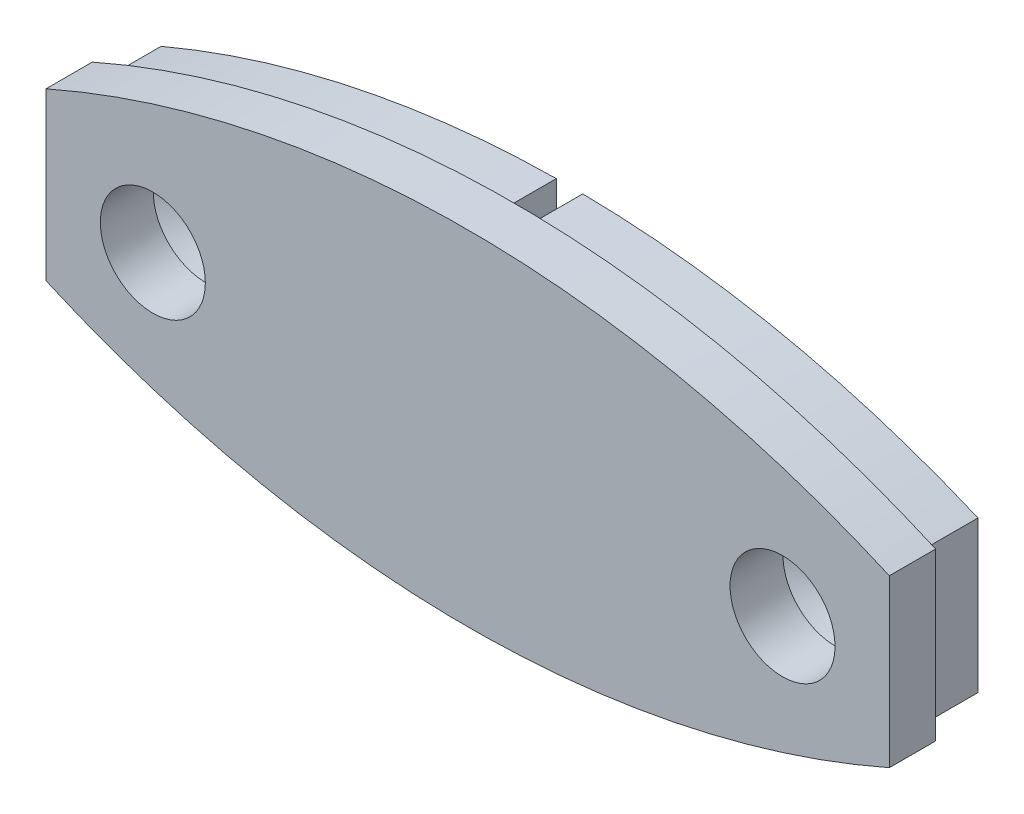
ISO-10303-21;
HEADER;
FILE_DESCRIPTION(('STEP AP214'),'2;1');
FILE_NAME('part.step','',(''),(''),'','','');
FILE_SCHEMA(('AUTOMOTIVE_DESIGN { 1 0 10303 214 1 1 1 1 }'));
ENDSEC;
DATA;
#1=APPLICATION_CONTEXT('core data for automotive mechanical design processes');
#2=APPLICATION_PROTOCOL_DEFINITION('international standard','automotive_design',2000,#1);
#3=PRODUCT_CONTEXT('',#1,'mechanical');
#4=PRODUCT('Part','Part','',(#3));
#5=PRODUCT_RELATED_PRODUCT_CATEGORY('part','',(#4));
#6=PRODUCT_DEFINITION_FORMATION('','',#4);
#7=PRODUCT_DEFINITION_CONTEXT('part definition',#1,'design');
#8=PRODUCT_DEFINITION('design','',#6,#7);
#9=PRODUCT_DEFINITION_SHAPE('','',#8);
#10=(LENGTH_UNIT() NAMED_UNIT(*) SI_UNIT(.MILLI.,.METRE.));
#11=(NAMED_UNIT(*) PLANE_ANGLE_UNIT() SI_UNIT($,.RADIAN.));
#12=(NAMED_UNIT(*) SI_UNIT($,.STERADIAN.) SOLID_ANGLE_UNIT());
#13=UNCERTAINTY_MEASURE_WITH_UNIT(LENGTH_MEASURE(1.E-05),#10,'distance_accuracy_value','');
#14=(GEOMETRIC_REPRESENTATION_CONTEXT(3) GLOBAL_UNCERTAINTY_ASSIGNED_CONTEXT((#13)) GLOBAL_UNIT_ASSIGNED_CONTEXT((#10,
#11,#12)) REPRESENTATION_CONTEXT('',''));
#15=CARTESIAN_POINT('',(0.,0.,0.));
#16=DIRECTION('',(0.,0.,1.));
#17=DIRECTION('',(1.,0.,0.));
#18=AXIS2_PLACEMENT_3D('',#15,#16,#17);
#19=CARTESIAN_POINT('',(0.,0.,0.));
#20=DIRECTION('',(0.,0.,1.));
#21=DIRECTION('',(1.,0.,0.));
#22=AXIS2_PLACEMENT_3D('',#19,#20,#21);
#23=PLANE('',#22);
#24=CARTESIAN_POINT('',(0.,-66.,0.));
#25=DIRECTION('',(0.,0.,1.));
#26=DIRECTION('',(1.,0.,0.));
#27=AXIS2_PLACEMENT_3D('',#24,#25,#26);
#28=CIRCLE('',#27,79.);
#29=CARTESIAN_POINT('',(31.875,6.28405339353902,0.));
#30=VERTEX_POINT('',#29);
#31=CARTESIAN_POINT('',(-31.875,6.28405339353901,0.));
#32=VERTEX_POINT('',#31);
#33=EDGE_CURVE('E26',#30,#32,#28,.T.);
#34=ORIENTED_EDGE('',*,*,#33,.F.);
#35=DIRECTION('',(0.,1.,0.));
#36=VECTOR('',#35,1.);
#37=CARTESIAN_POINT('',(31.875,-13.,0.));
#38=LINE('',#37,#36);
#39=CARTESIAN_POINT('',(31.875,-6.28405339353902,0.));
#40=VERTEX_POINT('',#39);
#41=EDGE_CURVE('E181',#40,#30,#38,.T.);
#42=ORIENTED_EDGE('',*,*,#41,.F.);
#43=CARTESIAN_POINT('',(0.,66.,0.));
#44=DIRECTION('',(0.,0.,1.));
#45=DIRECTION('',(1.,0.,0.));
#46=AXIS2_PLACEMENT_3D('',#43,#44,#45);
#47=CIRCLE('',#46,79.);
#48=CARTESIAN_POINT('',(-31.875,-6.28405339353901,0.));
#49=VERTEX_POINT('',#48);
#50=EDGE_CURVE('E190',#49,#40,#47,.T.);
#51=ORIENTED_EDGE('',*,*,#50,.F.);
#52=DIRECTION('',(0.,-1.,0.));
#53=VECTOR('',#52,1.);
#54=CARTESIAN_POINT('',(-31.875,13.,0.));
#55=LINE('',#54,#53);
#56=EDGE_CURVE('E20',#32,#49,#55,.T.);
#57=ORIENTED_EDGE('',*,*,#56,.F.);
#58=EDGE_LOOP('',(#34,#42,#51,#57));
#59=FACE_BOUND('',#58,.T.);
#60=DIRECTION('',(0.,-1.,0.));
#61=VECTOR('',#60,1.);
#62=CARTESIAN_POINT('',(1.,-5.996835316263,0.));
#63=LINE('',#62,#61);
#64=CARTESIAN_POINT('',(1.,11.993670632526,0.));
#65=VERTEX_POINT('',#64);
#66=CARTESIAN_POINT('',(1.,-11.993670632526,0.));
#67=VERTEX_POINT('',#66);
#68=EDGE_CURVE('E161',#65,#67,#63,.T.);
#69=ORIENTED_EDGE('',*,*,#68,.T.);
#70=CARTESIAN_POINT('',(0.,67.,0.));
#71=DIRECTION('',(0.,0.,1.));
#72=DIRECTION('',(1.,0.,0.));
#73=AXIS2_PLACEMENT_3D('',#70,#71,#72);
#74=CIRCLE('',#73,79.);
#75=CARTESIAN_POINT('',(30.875,-5.71680943908361,0.));
#76=VERTEX_POINT('',#75);
#77=EDGE_CURVE('E156',#67,#76,#74,.T.);
#78=ORIENTED_EDGE('',*,*,#77,.T.);
#79=DIRECTION('',(0.,1.,0.));
#80=VECTOR('',#79,1.);
#81=CARTESIAN_POINT('',(30.875,2.85840471954181,0.));
#82=LINE('',#81,#80);
#83=CARTESIAN_POINT('',(30.875,5.71680943908363,0.));
#84=VERTEX_POINT('',#83);
#85=EDGE_CURVE('E88',#76,#84,#82,.T.);
#86=ORIENTED_EDGE('',*,*,#85,.T.);
#87=CARTESIAN_POINT('',(0.,-67.,0.));
#88=DIRECTION('',(0.,0.,1.));
#89=DIRECTION('',(1.,0.,0.));
#90=AXIS2_PLACEMENT_3D('',#87,#88,#89);
#91=CIRCLE('',#90,79.);
#92=EDGE_CURVE('E168',#84,#65,#91,.T.);
#93=ORIENTED_EDGE('',*,*,#92,.T.);
#94=EDGE_LOOP('',(#69,#78,#86,#93));
#95=FACE_BOUND('',#94,.T.);
#96=DIRECTION('',(0.,1.,0.));
#97=VECTOR('',#96,1.);
#98=CARTESIAN_POINT('',(-1.,5.99683531626301,0.));
#99=LINE('',#98,#97);
#100=CARTESIAN_POINT('',(-1.,-11.993670632526,0.));
#101=VERTEX_POINT('',#100);
#102=CARTESIAN_POINT('',(-1.,11.993670632526,0.));
#103=VERTEX_POINT('',#102);
#104=EDGE_CURVE('E177',#101,#103,#99,.T.);
#105=ORIENTED_EDGE('',*,*,#104,.T.);
#106=CARTESIAN_POINT('',(0.,-67.,0.));
#107=DIRECTION('',(0.,0.,1.));
#108=DIRECTION('',(1.,0.,0.));
#109=AXIS2_PLACEMENT_3D('',#106,#107,#108);
#110=CIRCLE('',#109,79.);
#111=CARTESIAN_POINT('',(-30.875,5.71680943908362,0.));
#112=VERTEX_POINT('',#111);
#113=EDGE_CURVE('E179',#103,#112,#110,.T.);
#114=ORIENTED_EDGE('',*,*,#113,.T.);
#115=DIRECTION('',(0.,-1.,0.));
#116=VECTOR('',#115,1.);
#117=CARTESIAN_POINT('',(-30.875,-2.8584047195418,0.));
#118=LINE('',#117,#116);
#119=CARTESIAN_POINT('',(-30.875,-5.71680943908361,0.));
#120=VERTEX_POINT('',#119);
#121=EDGE_CURVE('E154',#112,#120,#118,.T.);
#122=ORIENTED_EDGE('',*,*,#121,.T.);
#123=CARTESIAN_POINT('',(0.,67.,0.));
#124=DIRECTION('',(0.,0.,1.));
#125=DIRECTION('',(1.,0.,0.));
#126=AXIS2_PLACEMENT_3D('',#123,#124,#125);
#127=CIRCLE('',#126,79.);
#128=EDGE_CURVE('E184',#120,#101,#127,.T.);
#129=ORIENTED_EDGE('',*,*,#128,.T.);
#130=EDGE_LOOP('',(#105,#114,#122,#129));
#131=FACE_BOUND('',#130,.T.);
#132=ADVANCED_FACE('F16',(#59,#95,#131),#23,.F.);
#133=CARTESIAN_POINT('',(0.,0.,3.5));
#134=DIRECTION('',(0.,0.,1.));
#135=DIRECTION('',(1.,0.,0.));
#136=AXIS2_PLACEMENT_3D('',#133,#134,#135);
#137=PLANE('',#136);
#138=CARTESIAN_POINT('',(0.,-66.,3.5));
#139=DIRECTION('',(0.,0.,1.));
#140=DIRECTION('',(1.,0.,0.));
#141=AXIS2_PLACEMENT_3D('',#138,#139,#140);
#142=CIRCLE('',#141,79.);
#143=CARTESIAN_POINT('',(31.875,6.28405339353902,3.5));
#144=VERTEX_POINT('',#143);
#145=CARTESIAN_POINT('',(-31.875,6.28405339353901,3.5));
#146=VERTEX_POINT('',#145);
#147=EDGE_CURVE('E10',#144,#146,#142,.T.);
#148=ORIENTED_EDGE('',*,*,#147,.T.);
#149=DIRECTION('',(0.,-1.,0.));
#150=VECTOR('',#149,1.);
#151=CARTESIAN_POINT('',(-31.875,13.,3.5));
#152=LINE('',#151,#150);
#153=CARTESIAN_POINT('',(-31.875,-6.28405339353901,3.5));
#154=VERTEX_POINT('',#153);
#155=EDGE_CURVE('E197',#146,#154,#152,.T.);
#156=ORIENTED_EDGE('',*,*,#155,.T.);
#157=CARTESIAN_POINT('',(0.,66.,3.5));
#158=DIRECTION('',(0.,0.,1.));
#159=DIRECTION('',(1.,0.,0.));
#160=AXIS2_PLACEMENT_3D('',#157,#158,#159);
#161=CIRCLE('',#160,79.);
#162=CARTESIAN_POINT('',(31.875,-6.28405339353902,3.5));
#163=VERTEX_POINT('',#162);
#164=EDGE_CURVE('E193',#154,#163,#161,.T.);
#165=ORIENTED_EDGE('',*,*,#164,.T.);
#166=DIRECTION('',(0.,1.,0.));
#167=VECTOR('',#166,1.);
#168=CARTESIAN_POINT('',(31.875,-13.,3.5));
#169=LINE('',#168,#167);
#170=EDGE_CURVE('E191',#163,#144,#169,.T.);
#171=ORIENTED_EDGE('',*,*,#170,.T.);
#172=EDGE_LOOP('',(#148,#156,#165,#171));
#173=FACE_BOUND('',#172,.T.);
#174=CARTESIAN_POINT('',(23.8,-0.399999999999978,3.5));
#175=DIRECTION('',(0.,0.,-1.));
#176=DIRECTION('',(1.,0.,0.));
#177=AXIS2_PLACEMENT_3D('',#174,#175,#176);
#178=CIRCLE('',#177,3.96875);
#179=CARTESIAN_POINT('',(27.76875,-0.399999999999978,3.5));
#180=VERTEX_POINT('',#179);
#181=EDGE_CURVE('E219',#180,#180,#178,.T.);
#182=ORIENTED_EDGE('',*,*,#181,.T.);
#183=EDGE_LOOP('',(#182));
#184=FACE_BOUND('',#183,.T.);
#185=CARTESIAN_POINT('',(-23.8,-0.399999999999978,3.5));
#186=DIRECTION('',(0.,0.,-1.));
#187=DIRECTION('',(1.,0.,0.));
#188=AXIS2_PLACEMENT_3D('',#185,#186,#187);
#189=CIRCLE('',#188,3.96875);
#190=CARTESIAN_POINT('',(-19.83125,-0.399999999999978,3.5));
#191=VERTEX_POINT('',#190);
#192=EDGE_CURVE('E144',#191,#191,#189,.T.);
#193=ORIENTED_EDGE('',*,*,#192,.T.);
#194=EDGE_LOOP('',(#193));
#195=FACE_BOUND('',#194,.T.);
#196=ADVANCED_FACE('F238',(#173,#184,#195),#137,.T.);
#197=CARTESIAN_POINT('',(0.,-66.,0.));
#198=DIRECTION('',(0.,0.,-1.));
#199=DIRECTION('',(1.,0.,0.));
#200=AXIS2_PLACEMENT_3D('',#197,#198,#199);
#201=CYLINDRICAL_SURFACE('',#200,79.);
#202=ORIENTED_EDGE('',*,*,#33,.T.);
#203=DIRECTION('',(0.,0.,1.));
#204=VECTOR('',#203,1.);
#205=CARTESIAN_POINT('',(-31.875,6.28405339353901,0.));
#206=LINE('',#205,#204);
#207=EDGE_CURVE('E172',#32,#146,#206,.T.);
#208=ORIENTED_EDGE('',*,*,#207,.T.);
#209=ORIENTED_EDGE('',*,*,#147,.F.);
#210=DIRECTION('',(0.,0.,1.));
#211=VECTOR('',#210,1.);
#212=CARTESIAN_POINT('',(31.875,6.28405339353902,0.));
#213=LINE('',#212,#211);
#214=EDGE_CURVE('E214',#30,#144,#213,.T.);
#215=ORIENTED_EDGE('',*,*,#214,.F.);
#216=EDGE_LOOP('',(#202,#208,#209,#215));
#217=FACE_BOUND('',#216,.T.);
#218=ADVANCED_FACE('F299',(#217),#201,.T.);
#219=CARTESIAN_POINT('',(-31.875,6.28405339353901,0.));
#220=DIRECTION('',(-1.,0.,0.));
#221=DIRECTION('',(0.,-1.,0.));
#222=AXIS2_PLACEMENT_3D('',#219,#220,#221);
#223=PLANE('',#222);
#224=ORIENTED_EDGE('',*,*,#56,.T.);
#225=DIRECTION('',(0.,0.,1.));
#226=VECTOR('',#225,1.);
#227=CARTESIAN_POINT('',(-31.875,-6.28405339353901,0.));
#228=LINE('',#227,#226);
#229=EDGE_CURVE('E203',#49,#154,#228,.T.);
#230=ORIENTED_EDGE('',*,*,#229,.T.);
#231=ORIENTED_EDGE('',*,*,#155,.F.);
#232=ORIENTED_EDGE('',*,*,#207,.F.);
#233=EDGE_LOOP('',(#224,#230,#231,#232));
#234=FACE_BOUND('',#233,.T.);
#235=ADVANCED_FACE('F296',(#234),#223,.T.);
#236=CARTESIAN_POINT('',(0.,66.,0.));
#237=DIRECTION('',(0.,0.,-1.));
#238=DIRECTION('',(1.,0.,0.));
#239=AXIS2_PLACEMENT_3D('',#236,#237,#238);
#240=CYLINDRICAL_SURFACE('',#239,79.);
#241=ORIENTED_EDGE('',*,*,#50,.T.);
#242=DIRECTION('',(0.,0.,1.));
#243=VECTOR('',#242,1.);
#244=CARTESIAN_POINT('',(31.875,-6.28405339353902,0.));
#245=LINE('',#244,#243);
#246=EDGE_CURVE('E187',#40,#163,#245,.T.);
#247=ORIENTED_EDGE('',*,*,#246,.T.);
#248=ORIENTED_EDGE('',*,*,#164,.F.);
#249=ORIENTED_EDGE('',*,*,#229,.F.);
#250=EDGE_LOOP('',(#241,#247,#248,#249));
#251=FACE_BOUND('',#250,.T.);
#252=ADVANCED_FACE('F255',(#251),#240,.T.);
#253=CARTESIAN_POINT('',(31.875,-6.28405339353902,0.));
#254=DIRECTION('',(1.,0.,0.));
#255=DIRECTION('',(0.,1.,0.));
#256=AXIS2_PLACEMENT_3D('',#253,#254,#255);
#257=PLANE('',#256);
#258=ORIENTED_EDGE('',*,*,#41,.T.);
#259=ORIENTED_EDGE('',*,*,#214,.T.);
#260=ORIENTED_EDGE('',*,*,#170,.F.);
#261=ORIENTED_EDGE('',*,*,#246,.F.);
#262=EDGE_LOOP('',(#258,#259,#260,#261));
#263=FACE_BOUND('',#262,.T.);
#264=ADVANCED_FACE('F260',(#263),#257,.T.);
#265=CARTESIAN_POINT('',(15.9375,0.,-4.2));
#266=DIRECTION('',(0.,0.,1.));
#267=DIRECTION('',(1.,0.,0.));
#268=AXIS2_PLACEMENT_3D('',#265,#266,#267);
#269=PLANE('',#268);
#270=CARTESIAN_POINT('',(0.,-67.,-4.2));
#271=DIRECTION('',(0.,0.,-1.));
#272=DIRECTION('',(1.,0.,0.));
#273=AXIS2_PLACEMENT_3D('',#270,#271,#272);
#274=CIRCLE('',#273,79.);
#275=CARTESIAN_POINT('',(1.,11.993670632526,-4.2));
#276=VERTEX_POINT('',#275);
#277=CARTESIAN_POINT('',(30.875,5.71680943908363,-4.2));
#278=VERTEX_POINT('',#277);
#279=EDGE_CURVE('E170',#276,#278,#274,.T.);
#280=ORIENTED_EDGE('',*,*,#279,.T.);
#281=DIRECTION('',(0.,-1.,0.));
#282=VECTOR('',#281,1.);
#283=CARTESIAN_POINT('',(30.875,-12.,-4.2));
#284=LINE('',#283,#282);
#285=CARTESIAN_POINT('',(30.875,-5.71680943908361,-4.2));
#286=VERTEX_POINT('',#285);
#287=EDGE_CURVE('E158',#278,#286,#284,.T.);
#288=ORIENTED_EDGE('',*,*,#287,.T.);
#289=CARTESIAN_POINT('',(0.,67.,-4.2));
#290=DIRECTION('',(0.,0.,-1.));
#291=DIRECTION('',(1.,0.,0.));
#292=AXIS2_PLACEMENT_3D('',#289,#290,#291);
#293=CIRCLE('',#292,79.);
#294=CARTESIAN_POINT('',(1.,-11.993670632526,-4.2));
#295=VERTEX_POINT('',#294);
#296=EDGE_CURVE('E95',#286,#295,#293,.T.);
#297=ORIENTED_EDGE('',*,*,#296,.T.);
#298=DIRECTION('',(0.,1.,0.));
#299=VECTOR('',#298,1.);
#300=CARTESIAN_POINT('',(1.,12.,-4.2));
#301=LINE('',#300,#299);
#302=EDGE_CURVE('E194',#295,#276,#301,.T.);
#303=ORIENTED_EDGE('',*,*,#302,.T.);
#304=EDGE_LOOP('',(#280,#288,#297,#303));
#305=FACE_BOUND('',#304,.T.);
#306=ADVANCED_FACE('F230',(#305),#269,.F.);
#307=CARTESIAN_POINT('',(0.,-67.,0.));
#308=DIRECTION('',(0.,0.,1.));
#309=DIRECTION('',(1.,0.,0.));
#310=AXIS2_PLACEMENT_3D('',#307,#308,#309);
#311=CYLINDRICAL_SURFACE('',#310,79.);
#312=ORIENTED_EDGE('',*,*,#92,.F.);
#313=DIRECTION('',(0.,0.,-1.));
#314=VECTOR('',#313,1.);
#315=CARTESIAN_POINT('',(30.875,5.71680943908363,0.));
#316=LINE('',#315,#314);
#317=EDGE_CURVE('E160',#84,#278,#316,.T.);
#318=ORIENTED_EDGE('',*,*,#317,.T.);
#319=ORIENTED_EDGE('',*,*,#279,.F.);
#320=DIRECTION('',(0.,0.,-1.));
#321=VECTOR('',#320,1.);
#322=CARTESIAN_POINT('',(1.,11.993670632526,0.));
#323=LINE('',#322,#321);
#324=EDGE_CURVE('E164',#65,#276,#323,.T.);
#325=ORIENTED_EDGE('',*,*,#324,.F.);
#326=EDGE_LOOP('',(#312,#318,#319,#325));
#327=FACE_BOUND('',#326,.T.);
#328=ADVANCED_FACE('F234',(#327),#311,.T.);
#329=CARTESIAN_POINT('',(30.875,5.71680943908363,0.));
#330=DIRECTION('',(1.,0.,0.));
#331=DIRECTION('',(0.,-1.,0.));
#332=AXIS2_PLACEMENT_3D('',#329,#330,#331);
#333=PLANE('',#332);
#334=ORIENTED_EDGE('',*,*,#85,.F.);
#335=DIRECTION('',(0.,0.,-1.));
#336=VECTOR('',#335,1.);
#337=CARTESIAN_POINT('',(30.875,-5.71680943908361,0.));
#338=LINE('',#337,#336);
#339=EDGE_CURVE('E155',#76,#286,#338,.T.);
#340=ORIENTED_EDGE('',*,*,#339,.T.);
#341=ORIENTED_EDGE('',*,*,#287,.F.);
#342=ORIENTED_EDGE('',*,*,#317,.F.);
#343=EDGE_LOOP('',(#334,#340,#341,#342));
#344=FACE_BOUND('',#343,.T.);
#345=ADVANCED_FACE('F18',(#344),#333,.T.);
#346=CARTESIAN_POINT('',(0.,67.,0.));
#347=DIRECTION('',(0.,0.,1.));
#348=DIRECTION('',(1.,0.,0.));
#349=AXIS2_PLACEMENT_3D('',#346,#347,#348);
#350=CYLINDRICAL_SURFACE('',#349,79.);
#351=ORIENTED_EDGE('',*,*,#77,.F.);
#352=DIRECTION('',(0.,0.,-1.));
#353=VECTOR('',#352,1.);
#354=CARTESIAN_POINT('',(1.,-11.993670632526,0.));
#355=LINE('',#354,#353);
#356=EDGE_CURVE('E196',#67,#295,#355,.T.);
#357=ORIENTED_EDGE('',*,*,#356,.T.);
#358=ORIENTED_EDGE('',*,*,#296,.F.);
#359=ORIENTED_EDGE('',*,*,#339,.F.);
#360=EDGE_LOOP('',(#351,#357,#358,#359));
#361=FACE_BOUND('',#360,.T.);
#362=ADVANCED_FACE('F225',(#361),#350,.T.);
#363=CARTESIAN_POINT('',(1.,-11.993670632526,0.));
#364=DIRECTION('',(-1.,0.,0.));
#365=DIRECTION('',(0.,1.,0.));
#366=AXIS2_PLACEMENT_3D('',#363,#364,#365);
#367=PLANE('',#366);
#368=ORIENTED_EDGE('',*,*,#68,.F.);
#369=ORIENTED_EDGE('',*,*,#324,.T.);
#370=ORIENTED_EDGE('',*,*,#302,.F.);
#371=ORIENTED_EDGE('',*,*,#356,.F.);
#372=EDGE_LOOP('',(#368,#369,#370,#371));
#373=FACE_BOUND('',#372,.T.);
#374=ADVANCED_FACE('F228',(#373),#367,.T.);
#375=CARTESIAN_POINT('',(-15.9375,0.,-4.2));
#376=DIRECTION('',(0.,0.,1.));
#377=DIRECTION('',(1.,0.,0.));
#378=AXIS2_PLACEMENT_3D('',#375,#376,#377);
#379=PLANE('',#378);
#380=CARTESIAN_POINT('',(0.,67.,-4.2));
#381=DIRECTION('',(0.,0.,-1.));
#382=DIRECTION('',(1.,0.,0.));
#383=AXIS2_PLACEMENT_3D('',#380,#381,#382);
#384=CIRCLE('',#383,79.);
#385=CARTESIAN_POINT('',(-1.,-11.993670632526,-4.2));
#386=VERTEX_POINT('',#385);
#387=CARTESIAN_POINT('',(-30.875,-5.71680943908361,-4.2));
#388=VERTEX_POINT('',#387);
#389=EDGE_CURVE('E132',#386,#388,#384,.T.);
#390=ORIENTED_EDGE('',*,*,#389,.T.);
#391=DIRECTION('',(0.,1.,0.));
#392=VECTOR('',#391,1.);
#393=CARTESIAN_POINT('',(-30.875,12.,-4.2));
#394=LINE('',#393,#392);
#395=CARTESIAN_POINT('',(-30.875,5.71680943908362,-4.2));
#396=VERTEX_POINT('',#395);
#397=EDGE_CURVE('E167',#388,#396,#394,.T.);
#398=ORIENTED_EDGE('',*,*,#397,.T.);
#399=CARTESIAN_POINT('',(0.,-67.,-4.2));
#400=DIRECTION('',(0.,0.,-1.));
#401=DIRECTION('',(1.,0.,0.));
#402=AXIS2_PLACEMENT_3D('',#399,#400,#401);
#403=CIRCLE('',#402,79.);
#404=CARTESIAN_POINT('',(-1.,11.993670632526,-4.2));
#405=VERTEX_POINT('',#404);
#406=EDGE_CURVE('E125',#396,#405,#403,.T.);
#407=ORIENTED_EDGE('',*,*,#406,.T.);
#408=DIRECTION('',(0.,-1.,0.));
#409=VECTOR('',#408,1.);
#410=CARTESIAN_POINT('',(-1.,-12.,-4.2));
#411=LINE('',#410,#409);
#412=EDGE_CURVE('E176',#405,#386,#411,.T.);
#413=ORIENTED_EDGE('',*,*,#412,.T.);
#414=EDGE_LOOP('',(#390,#398,#407,#413));
#415=FACE_BOUND('',#414,.T.);
#416=ADVANCED_FACE('F269',(#415),#379,.F.);
#417=CARTESIAN_POINT('',(0.,67.,0.));
#418=DIRECTION('',(0.,0.,1.));
#419=DIRECTION('',(1.,0.,0.));
#420=AXIS2_PLACEMENT_3D('',#417,#418,#419);
#421=CYLINDRICAL_SURFACE('',#420,79.);
#422=ORIENTED_EDGE('',*,*,#128,.F.);
#423=DIRECTION('',(0.,0.,-1.));
#424=VECTOR('',#423,1.);
#425=CARTESIAN_POINT('',(-30.875,-5.71680943908361,0.));
#426=LINE('',#425,#424);
#427=EDGE_CURVE('E186',#120,#388,#426,.T.);
#428=ORIENTED_EDGE('',*,*,#427,.T.);
#429=ORIENTED_EDGE('',*,*,#389,.F.);
#430=DIRECTION('',(0.,0.,-1.));
#431=VECTOR('',#430,1.);
#432=CARTESIAN_POINT('',(-1.,-11.993670632526,0.));
#433=LINE('',#432,#431);
#434=EDGE_CURVE('E173',#101,#386,#433,.T.);
#435=ORIENTED_EDGE('',*,*,#434,.F.);
#436=EDGE_LOOP('',(#422,#428,#429,#435));
#437=FACE_BOUND('',#436,.T.);
#438=ADVANCED_FACE('F265',(#437),#421,.T.);
#439=CARTESIAN_POINT('',(-30.875,-5.71680943908361,0.));
#440=DIRECTION('',(-1.,0.,0.));
#441=DIRECTION('',(0.,1.,0.));
#442=AXIS2_PLACEMENT_3D('',#439,#440,#441);
#443=PLANE('',#442);
#444=ORIENTED_EDGE('',*,*,#121,.F.);
#445=DIRECTION('',(0.,0.,-1.));
#446=VECTOR('',#445,1.);
#447=CARTESIAN_POINT('',(-30.875,5.71680943908362,0.));
#448=LINE('',#447,#446);
#449=EDGE_CURVE('E151',#112,#396,#448,.T.);
#450=ORIENTED_EDGE('',*,*,#449,.T.);
#451=ORIENTED_EDGE('',*,*,#397,.F.);
#452=ORIENTED_EDGE('',*,*,#427,.F.);
#453=EDGE_LOOP('',(#444,#450,#451,#452));
#454=FACE_BOUND('',#453,.T.);
#455=ADVANCED_FACE('F267',(#454),#443,.T.);
#456=CARTESIAN_POINT('',(0.,-67.,0.));
#457=DIRECTION('',(0.,0.,1.));
#458=DIRECTION('',(1.,0.,0.));
#459=AXIS2_PLACEMENT_3D('',#456,#457,#458);
#460=CYLINDRICAL_SURFACE('',#459,79.);
#461=ORIENTED_EDGE('',*,*,#113,.F.);
#462=DIRECTION('',(0.,0.,-1.));
#463=VECTOR('',#462,1.);
#464=CARTESIAN_POINT('',(-1.,11.993670632526,0.));
#465=LINE('',#464,#463);
#466=EDGE_CURVE('E182',#103,#405,#465,.T.);
#467=ORIENTED_EDGE('',*,*,#466,.T.);
#468=ORIENTED_EDGE('',*,*,#406,.F.);
#469=ORIENTED_EDGE('',*,*,#449,.F.);
#470=EDGE_LOOP('',(#461,#467,#468,#469));
#471=FACE_BOUND('',#470,.T.);
#472=ADVANCED_FACE('F274',(#471),#460,.T.);
#473=CARTESIAN_POINT('',(-1.,11.993670632526,0.));
#474=DIRECTION('',(1.,0.,0.));
#475=DIRECTION('',(0.,-1.,0.));
#476=AXIS2_PLACEMENT_3D('',#473,#474,#475);
#477=PLANE('',#476);
#478=ORIENTED_EDGE('',*,*,#104,.F.);
#479=ORIENTED_EDGE('',*,*,#434,.T.);
#480=ORIENTED_EDGE('',*,*,#412,.F.);
#481=ORIENTED_EDGE('',*,*,#466,.F.);
#482=EDGE_LOOP('',(#478,#479,#480,#481));
#483=FACE_BOUND('',#482,.T.);
#484=ADVANCED_FACE('F271',(#483),#477,.T.);
#485=CARTESIAN_POINT('',(23.8,-0.399999999999978,1.5));
#486=DIRECTION('',(0.,0.,1.));
#487=DIRECTION('',(1.,0.,0.));
#488=AXIS2_PLACEMENT_3D('',#485,#486,#487);
#489=CYLINDRICAL_SURFACE('',#488,3.96875);
#490=CARTESIAN_POINT('',(23.8,-0.399999999999978,-0.5));
#491=DIRECTION('',(0.,0.,-1.));
#492=DIRECTION('',(1.,0.,0.));
#493=AXIS2_PLACEMENT_3D('',#490,#491,#492);
#494=CIRCLE('',#493,3.96875);
#495=CARTESIAN_POINT('',(27.76875,-0.399999999999978,-0.5));
#496=VERTEX_POINT('',#495);
#497=EDGE_CURVE('E146',#496,#496,#494,.T.);
#498=ORIENTED_EDGE('',*,*,#497,.T.);
#499=EDGE_LOOP('',(#498));
#500=FACE_BOUND('',#499,.T.);
#501=ORIENTED_EDGE('',*,*,#181,.F.);
#502=EDGE_LOOP('',(#501));
#503=FACE_BOUND('',#502,.T.);
#504=ADVANCED_FACE('F273',(#500,#503),#489,.F.);
#505=CARTESIAN_POINT('',(23.8,-0.399999999999978,-1.42532925915132));
#506=DIRECTION('',(0.,0.,1.));
#507=DIRECTION('',(1.,0.,0.));
#508=AXIS2_PLACEMENT_3D('',#505,#506,#507);
#509=CONICAL_SURFACE('',#508,1.984375,1.13446401379631);
#510=CARTESIAN_POINT('',(23.8,-0.399999999999978,-2.35065851830265));
#511=VERTEX_POINT('',#510);
#512=VERTEX_LOOP('',#511);
#513=FACE_BOUND('',#512,.T.);
#514=ORIENTED_EDGE('',*,*,#497,.F.);
#515=EDGE_LOOP('',(#514));
#516=FACE_BOUND('',#515,.T.);
#517=ADVANCED_FACE('F281',(#513,#516),#509,.F.);
#518=CARTESIAN_POINT('',(-23.8,-0.399999999999978,1.5));
#519=DIRECTION('',(0.,0.,1.));
#520=DIRECTION('',(1.,0.,0.));
#521=AXIS2_PLACEMENT_3D('',#518,#519,#520);
#522=CYLINDRICAL_SURFACE('',#521,3.96875);
#523=CARTESIAN_POINT('',(-23.8,-0.399999999999978,-0.5));
#524=DIRECTION('',(0.,0.,-1.));
#525=DIRECTION('',(1.,0.,0.));
#526=AXIS2_PLACEMENT_3D('',#523,#524,#525);
#527=CIRCLE('',#526,3.96875);
#528=CARTESIAN_POINT('',(-19.83125,-0.399999999999978,-0.5));
#529=VERTEX_POINT('',#528);
#530=EDGE_CURVE('E142',#529,#529,#527,.T.);
#531=ORIENTED_EDGE('',*,*,#530,.T.);
#532=EDGE_LOOP('',(#531));
#533=FACE_BOUND('',#532,.T.);
#534=ORIENTED_EDGE('',*,*,#192,.F.);
#535=EDGE_LOOP('',(#534));
#536=FACE_BOUND('',#535,.T.);
#537=ADVANCED_FACE('F139',(#533,#536),#522,.F.);
#538=CARTESIAN_POINT('',(-23.8,-0.399999999999978,-1.42532925915132));
#539=DIRECTION('',(0.,0.,1.));
#540=DIRECTION('',(1.,0.,0.));
#541=AXIS2_PLACEMENT_3D('',#538,#539,#540);
#542=CONICAL_SURFACE('',#541,1.984375,1.13446401379631);
#543=CARTESIAN_POINT('',(-23.8,-0.399999999999978,-2.35065851830265));
#544=VERTEX_POINT('',#543);
#545=VERTEX_LOOP('',#544);
#546=FACE_BOUND('',#545,.T.);
#547=ORIENTED_EDGE('',*,*,#530,.F.);
#548=EDGE_LOOP('',(#547));
#549=FACE_BOUND('',#548,.T.);
#550=ADVANCED_FACE('F136',(#546,#549),#542,.F.);
#551=CLOSED_SHELL('',(#132,#196,#218,#235,#252,#264,#306,#328,#345,#362,#374,#416,#438,#455,
#472,#484,#504,#517,#537,#550));
#552=MANIFOLD_SOLID_BREP('B1',#551);
#553=ADVANCED_BREP_SHAPE_REPRESENTATION('',(#18,#552),#14);
#554=SHAPE_DEFINITION_REPRESENTATION(#9,#553);
ENDSEC;
END-ISO-10303-21;
